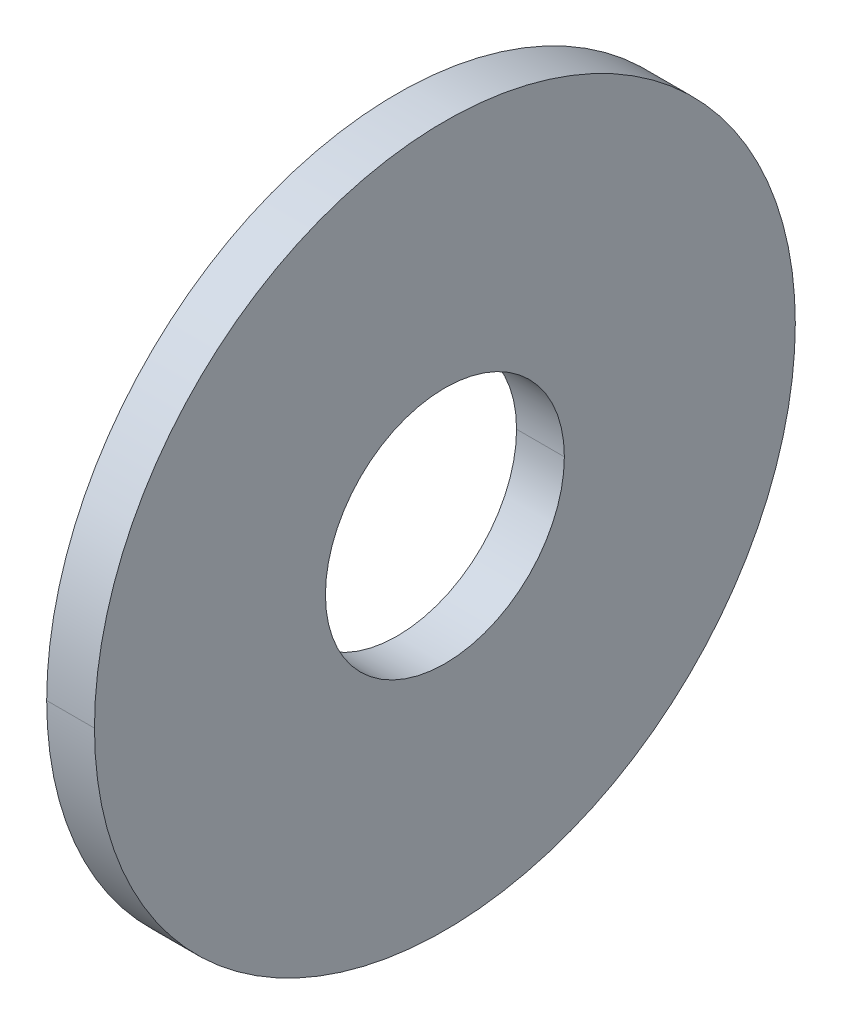
ISO-10303-21;
HEADER;
FILE_DESCRIPTION(('STEP AP214'),'2;1');
FILE_NAME('part.step','',(''),(''),'','','');
FILE_SCHEMA(('AUTOMOTIVE_DESIGN { 1 0 10303 214 1 1 1 1 }'));
ENDSEC;
DATA;
#1=APPLICATION_CONTEXT('core data for automotive mechanical design processes');
#2=APPLICATION_PROTOCOL_DEFINITION('international standard','automotive_design',2000,#1);
#3=PRODUCT_CONTEXT('',#1,'mechanical');
#4=PRODUCT('Part','Part','',(#3));
#5=PRODUCT_RELATED_PRODUCT_CATEGORY('part','',(#4));
#6=PRODUCT_DEFINITION_FORMATION('','',#4);
#7=PRODUCT_DEFINITION_CONTEXT('part definition',#1,'design');
#8=PRODUCT_DEFINITION('design','',#6,#7);
#9=PRODUCT_DEFINITION_SHAPE('','',#8);
#10=(LENGTH_UNIT() NAMED_UNIT(*) SI_UNIT(.MILLI.,.METRE.));
#11=(NAMED_UNIT(*) PLANE_ANGLE_UNIT() SI_UNIT($,.RADIAN.));
#12=(NAMED_UNIT(*) SI_UNIT($,.STERADIAN.) SOLID_ANGLE_UNIT());
#13=UNCERTAINTY_MEASURE_WITH_UNIT(LENGTH_MEASURE(1.E-05),#10,'distance_accuracy_value','');
#14=(GEOMETRIC_REPRESENTATION_CONTEXT(3) GLOBAL_UNCERTAINTY_ASSIGNED_CONTEXT((#13)) GLOBAL_UNIT_ASSIGNED_CONTEXT((#10,
#11,#12)) REPRESENTATION_CONTEXT('',''));
#15=CARTESIAN_POINT('',(0.,0.,0.));
#16=DIRECTION('',(0.,0.,1.));
#17=DIRECTION('',(1.,0.,0.));
#18=AXIS2_PLACEMENT_3D('',#15,#16,#17);
#19=CARTESIAN_POINT('',(-3.,22.,0.));
#20=DIRECTION('',(1.,0.,0.));
#21=DIRECTION('',(0.,1.,0.));
#22=AXIS2_PLACEMENT_3D('',#19,#20,#21);
#23=PLANE('',#22);
#24=CARTESIAN_POINT('',(-3.,0.,0.));
#25=DIRECTION('',(-1.,0.,0.));
#26=DIRECTION('',(0.,0.,1.));
#27=AXIS2_PLACEMENT_3D('',#24,#25,#26);
#28=CIRCLE('',#27,7.5);
#29=CARTESIAN_POINT('',(-3.,0.,7.5));
#30=VERTEX_POINT('',#29);
#31=CARTESIAN_POINT('',(-3.,0.,-7.5));
#32=VERTEX_POINT('',#31);
#33=EDGE_CURVE('E38',#30,#32,#28,.T.);
#34=ORIENTED_EDGE('',*,*,#33,.F.);
#35=CARTESIAN_POINT('',(-3.,0.,0.));
#36=DIRECTION('',(-1.,0.,0.));
#37=DIRECTION('',(0.,0.,1.));
#38=AXIS2_PLACEMENT_3D('',#35,#36,#37);
#39=CIRCLE('',#38,7.5);
#40=EDGE_CURVE('E108',#32,#30,#39,.T.);
#41=ORIENTED_EDGE('',*,*,#40,.F.);
#42=EDGE_LOOP('',(#34,#41));
#43=FACE_BOUND('',#42,.T.);
#44=CARTESIAN_POINT('',(-3.,0.,0.));
#45=DIRECTION('',(-1.,0.,0.));
#46=DIRECTION('',(0.,0.,1.));
#47=AXIS2_PLACEMENT_3D('',#44,#45,#46);
#48=CIRCLE('',#47,22.);
#49=CARTESIAN_POINT('',(-3.,0.,22.));
#50=VERTEX_POINT('',#49);
#51=CARTESIAN_POINT('',(-3.,0.,-22.));
#52=VERTEX_POINT('',#51);
#53=EDGE_CURVE('E93',#50,#52,#48,.T.);
#54=ORIENTED_EDGE('',*,*,#53,.T.);
#55=CARTESIAN_POINT('',(-3.,0.,0.));
#56=DIRECTION('',(-1.,0.,0.));
#57=DIRECTION('',(0.,0.,1.));
#58=AXIS2_PLACEMENT_3D('',#55,#56,#57);
#59=CIRCLE('',#58,22.);
#60=EDGE_CURVE('E10',#52,#50,#59,.T.);
#61=ORIENTED_EDGE('',*,*,#60,.T.);
#62=EDGE_LOOP('',(#54,#61));
#63=FACE_BOUND('',#62,.T.);
#64=ADVANCED_FACE('F16',(#43,#63),#23,.F.);
#65=CARTESIAN_POINT('',(-34.925,0.,0.));
#66=DIRECTION('',(-1.,0.,0.));
#67=DIRECTION('',(0.,0.,1.));
#68=AXIS2_PLACEMENT_3D('',#65,#66,#67);
#69=CYLINDRICAL_SURFACE('',#68,22.);
#70=DIRECTION('',(-1.,0.,0.));
#71=VECTOR('',#70,1.);
#72=CARTESIAN_POINT('',(-34.925,0.,-22.));
#73=LINE('',#72,#71);
#74=CARTESIAN_POINT('',(0.,0.,-22.));
#75=VERTEX_POINT('',#74);
#76=EDGE_CURVE('E85',#75,#52,#73,.T.);
#77=ORIENTED_EDGE('',*,*,#76,.F.);
#78=CARTESIAN_POINT('',(0.,0.,0.));
#79=DIRECTION('',(-1.,0.,0.));
#80=DIRECTION('',(0.,0.,1.));
#81=AXIS2_PLACEMENT_3D('',#78,#79,#80);
#82=CIRCLE('',#81,22.);
#83=CARTESIAN_POINT('',(0.,0.,22.));
#84=VERTEX_POINT('',#83);
#85=EDGE_CURVE('E26',#75,#84,#82,.T.);
#86=ORIENTED_EDGE('',*,*,#85,.T.);
#87=DIRECTION('',(-1.,0.,0.));
#88=VECTOR('',#87,1.);
#89=CARTESIAN_POINT('',(-34.925,0.,22.));
#90=LINE('',#89,#88);
#91=EDGE_CURVE('E82',#84,#50,#90,.T.);
#92=ORIENTED_EDGE('',*,*,#91,.T.);
#93=ORIENTED_EDGE('',*,*,#60,.F.);
#94=EDGE_LOOP('',(#77,#86,#92,#93));
#95=FACE_BOUND('',#94,.T.);
#96=ADVANCED_FACE('F18',(#95),#69,.T.);
#97=CARTESIAN_POINT('',(0.,7.5,0.));
#98=DIRECTION('',(-1.,0.,0.));
#99=DIRECTION('',(0.,0.,1.));
#100=AXIS2_PLACEMENT_3D('',#97,#98,#99);
#101=PLANE('',#100);
#102=CARTESIAN_POINT('',(0.,0.,0.));
#103=DIRECTION('',(-1.,0.,0.));
#104=DIRECTION('',(0.,0.,1.));
#105=AXIS2_PLACEMENT_3D('',#102,#103,#104);
#106=CIRCLE('',#105,7.5);
#107=CARTESIAN_POINT('',(0.,0.,7.5));
#108=VERTEX_POINT('',#107);
#109=CARTESIAN_POINT('',(0.,0.,-7.5));
#110=VERTEX_POINT('',#109);
#111=EDGE_CURVE('E51',#108,#110,#106,.T.);
#112=ORIENTED_EDGE('',*,*,#111,.T.);
#113=CARTESIAN_POINT('',(0.,0.,0.));
#114=DIRECTION('',(-1.,0.,0.));
#115=DIRECTION('',(0.,0.,1.));
#116=AXIS2_PLACEMENT_3D('',#113,#114,#115);
#117=CIRCLE('',#116,7.5);
#118=EDGE_CURVE('E95',#110,#108,#117,.T.);
#119=ORIENTED_EDGE('',*,*,#118,.T.);
#120=EDGE_LOOP('',(#112,#119));
#121=FACE_BOUND('',#120,.T.);
#122=CARTESIAN_POINT('',(0.,0.,0.));
#123=DIRECTION('',(-1.,0.,0.));
#124=DIRECTION('',(0.,0.,1.));
#125=AXIS2_PLACEMENT_3D('',#122,#123,#124);
#126=CIRCLE('',#125,22.);
#127=EDGE_CURVE('E92',#84,#75,#126,.T.);
#128=ORIENTED_EDGE('',*,*,#127,.F.);
#129=ORIENTED_EDGE('',*,*,#85,.F.);
#130=EDGE_LOOP('',(#128,#129));
#131=FACE_BOUND('',#130,.T.);
#132=ADVANCED_FACE('F97',(#121,#131),#101,.F.);
#133=CARTESIAN_POINT('',(-34.925,0.,0.));
#134=DIRECTION('',(-1.,0.,0.));
#135=DIRECTION('',(0.,0.,1.));
#136=AXIS2_PLACEMENT_3D('',#133,#134,#135);
#137=CYLINDRICAL_SURFACE('',#136,7.5);
#138=DIRECTION('',(-1.,0.,0.));
#139=VECTOR('',#138,1.);
#140=CARTESIAN_POINT('',(-34.925,0.,-7.5));
#141=LINE('',#140,#139);
#142=EDGE_CURVE('E106',#110,#32,#141,.T.);
#143=ORIENTED_EDGE('',*,*,#142,.F.);
#144=ORIENTED_EDGE('',*,*,#111,.F.);
#145=DIRECTION('',(-1.,0.,0.));
#146=VECTOR('',#145,1.);
#147=CARTESIAN_POINT('',(-34.925,0.,7.5));
#148=LINE('',#147,#146);
#149=EDGE_CURVE('E117',#108,#30,#148,.T.);
#150=ORIENTED_EDGE('',*,*,#149,.T.);
#151=ORIENTED_EDGE('',*,*,#33,.T.);
#152=EDGE_LOOP('',(#143,#144,#150,#151));
#153=FACE_BOUND('',#152,.T.);
#154=ADVANCED_FACE('F125',(#153),#137,.F.);
#155=CARTESIAN_POINT('',(-34.925,0.,0.));
#156=DIRECTION('',(-1.,0.,0.));
#157=DIRECTION('',(0.,0.,1.));
#158=AXIS2_PLACEMENT_3D('',#155,#156,#157);
#159=CYLINDRICAL_SURFACE('',#158,7.5);
#160=ORIENTED_EDGE('',*,*,#118,.F.);
#161=ORIENTED_EDGE('',*,*,#142,.T.);
#162=ORIENTED_EDGE('',*,*,#40,.T.);
#163=ORIENTED_EDGE('',*,*,#149,.F.);
#164=EDGE_LOOP('',(#160,#161,#162,#163));
#165=FACE_BOUND('',#164,.T.);
#166=ADVANCED_FACE('F128',(#165),#159,.F.);
#167=CARTESIAN_POINT('',(-34.925,0.,0.));
#168=DIRECTION('',(-1.,0.,0.));
#169=DIRECTION('',(0.,0.,1.));
#170=AXIS2_PLACEMENT_3D('',#167,#168,#169);
#171=CYLINDRICAL_SURFACE('',#170,22.);
#172=ORIENTED_EDGE('',*,*,#127,.T.);
#173=ORIENTED_EDGE('',*,*,#76,.T.);
#174=ORIENTED_EDGE('',*,*,#53,.F.);
#175=ORIENTED_EDGE('',*,*,#91,.F.);
#176=EDGE_LOOP('',(#172,#173,#174,#175));
#177=FACE_BOUND('',#176,.T.);
#178=ADVANCED_FACE('F91',(#177),#171,.T.);
#179=CLOSED_SHELL('',(#64,#96,#132,#154,#166,#178));
#180=MANIFOLD_SOLID_BREP('B1',#179);
#181=ADVANCED_BREP_SHAPE_REPRESENTATION('',(#18,#180),#14);
#182=SHAPE_DEFINITION_REPRESENTATION(#9,#181);
ENDSEC;
END-ISO-10303-21;
